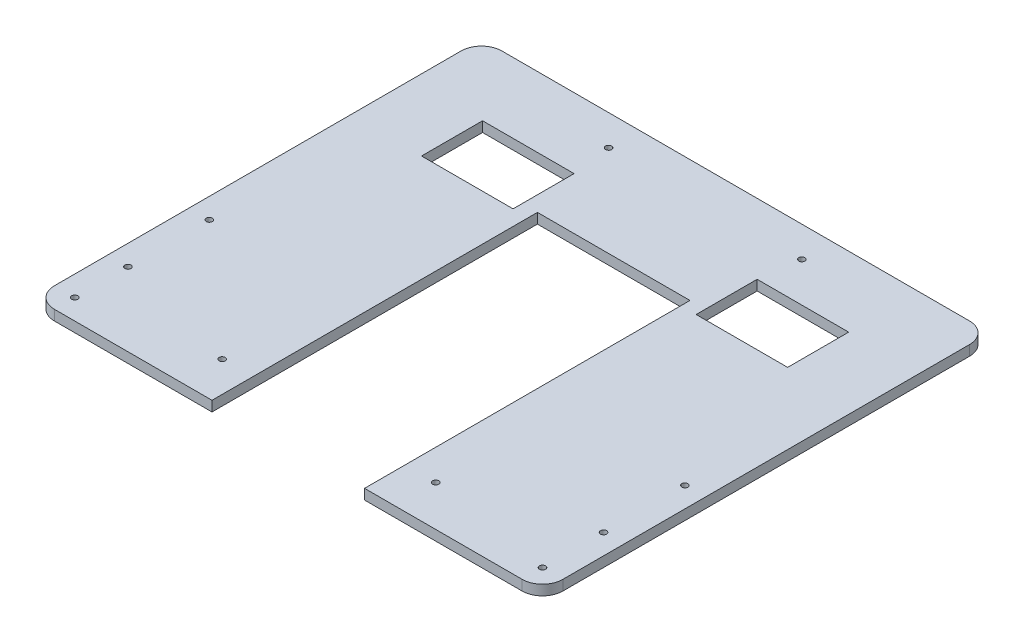
ISO-10303-21;
HEADER;
FILE_DESCRIPTION(('STEP AP214'),'2;1');
FILE_NAME('part.step','',(''),(''),'','','');
FILE_SCHEMA(('AUTOMOTIVE_DESIGN { 1 0 10303 214 1 1 1 1 }'));
ENDSEC;
DATA;
#1=APPLICATION_CONTEXT('core data for automotive mechanical design processes');
#2=APPLICATION_PROTOCOL_DEFINITION('international standard','automotive_design',2000,#1);
#3=PRODUCT_CONTEXT('',#1,'mechanical');
#4=PRODUCT('Part','Part','',(#3));
#5=PRODUCT_RELATED_PRODUCT_CATEGORY('part','',(#4));
#6=PRODUCT_DEFINITION_FORMATION('','',#4);
#7=PRODUCT_DEFINITION_CONTEXT('part definition',#1,'design');
#8=PRODUCT_DEFINITION('design','',#6,#7);
#9=PRODUCT_DEFINITION_SHAPE('','',#8);
#10=(LENGTH_UNIT() NAMED_UNIT(*) SI_UNIT(.MILLI.,.METRE.));
#11=(NAMED_UNIT(*) PLANE_ANGLE_UNIT() SI_UNIT($,.RADIAN.));
#12=(NAMED_UNIT(*) SI_UNIT($,.STERADIAN.) SOLID_ANGLE_UNIT());
#13=UNCERTAINTY_MEASURE_WITH_UNIT(LENGTH_MEASURE(1.E-05),#10,'distance_accuracy_value','');
#14=(GEOMETRIC_REPRESENTATION_CONTEXT(3) GLOBAL_UNCERTAINTY_ASSIGNED_CONTEXT((#13)) GLOBAL_UNIT_ASSIGNED_CONTEXT((#10,
#11,#12)) REPRESENTATION_CONTEXT('',''));
#15=CARTESIAN_POINT('',(0.,0.,0.));
#16=DIRECTION('',(0.,0.,1.));
#17=DIRECTION('',(1.,0.,0.));
#18=AXIS2_PLACEMENT_3D('',#15,#16,#17);
#19=CARTESIAN_POINT('',(10.,5.,210.));
#20=DIRECTION('',(0.,1.,0.));
#21=DIRECTION('',(0.,0.,1.));
#22=AXIS2_PLACEMENT_3D('',#19,#20,#21);
#23=PLANE('',#22);
#24=CARTESIAN_POINT('',(10.0000000000001,5.,183.835525880241));
#25=DIRECTION('',(0.,1.,0.));
#26=DIRECTION('',(0.,0.,1.));
#27=AXIS2_PLACEMENT_3D('',#24,#25,#26);
#28=CIRCLE('',#27,1.5);
#29=CARTESIAN_POINT('',(10.0000000000001,5.,185.335525880241));
#30=VERTEX_POINT('',#29);
#31=EDGE_CURVE('E760',#30,#30,#28,.F.);
#32=ORIENTED_EDGE('',*,*,#31,.T.);
#33=EDGE_LOOP('',(#32));
#34=FACE_BOUND('',#33,.T.);
#35=CARTESIAN_POINT('',(10.0000000000001,5.,143.835525880241));
#36=DIRECTION('',(0.,1.,0.));
#37=DIRECTION('',(0.,0.,1.));
#38=AXIS2_PLACEMENT_3D('',#35,#36,#37);
#39=CIRCLE('',#38,1.5);
#40=CARTESIAN_POINT('',(10.0000000000001,5.,145.335525880241));
#41=VERTEX_POINT('',#40);
#42=EDGE_CURVE('E762',#41,#41,#39,.F.);
#43=ORIENTED_EDGE('',*,*,#42,.T.);
#44=EDGE_LOOP('',(#43));
#45=FACE_BOUND('',#44,.T.);
#46=CARTESIAN_POINT('',(240.,5.,140.));
#47=DIRECTION('',(0.,1.,0.));
#48=DIRECTION('',(0.,0.,1.));
#49=AXIS2_PLACEMENT_3D('',#46,#47,#48);
#50=CIRCLE('',#49,1.5);
#51=CARTESIAN_POINT('',(240.,5.,141.5));
#52=VERTEX_POINT('',#51);
#53=EDGE_CURVE('E833',#52,#52,#50,.F.);
#54=ORIENTED_EDGE('',*,*,#53,.T.);
#55=EDGE_LOOP('',(#54));
#56=FACE_BOUND('',#55,.T.);
#57=CARTESIAN_POINT('',(240.,5.,180.));
#58=DIRECTION('',(0.,1.,0.));
#59=DIRECTION('',(0.,0.,1.));
#60=AXIS2_PLACEMENT_3D('',#57,#58,#59);
#61=CIRCLE('',#60,1.5);
#62=CARTESIAN_POINT('',(240.,5.,181.5));
#63=VERTEX_POINT('',#62);
#64=EDGE_CURVE('E771',#63,#63,#61,.F.);
#65=ORIENTED_EDGE('',*,*,#64,.T.);
#66=EDGE_LOOP('',(#65));
#67=FACE_BOUND('',#66,.T.);
#68=CARTESIAN_POINT('',(172.5,5.,15.));
#69=DIRECTION('',(0.,1.,0.));
#70=DIRECTION('',(0.,0.,1.));
#71=AXIS2_PLACEMENT_3D('',#68,#69,#70);
#72=CIRCLE('',#71,1.49999999999997);
#73=CARTESIAN_POINT('',(172.5,5.,16.5));
#74=VERTEX_POINT('',#73);
#75=EDGE_CURVE('E788',#74,#74,#72,.F.);
#76=ORIENTED_EDGE('',*,*,#75,.T.);
#77=EDGE_LOOP('',(#76));
#78=FACE_BOUND('',#77,.T.);
#79=CARTESIAN_POINT('',(240.,5.,210.));
#80=DIRECTION('',(0.,1.,0.));
#81=DIRECTION('',(0.,0.,1.));
#82=AXIS2_PLACEMENT_3D('',#79,#80,#81);
#83=CIRCLE('',#82,1.50000000000002);
#84=CARTESIAN_POINT('',(240.,5.,211.5));
#85=VERTEX_POINT('',#84);
#86=EDGE_CURVE('E782',#85,#85,#83,.F.);
#87=ORIENTED_EDGE('',*,*,#86,.T.);
#88=EDGE_LOOP('',(#87));
#89=FACE_BOUND('',#88,.T.);
#90=CARTESIAN_POINT('',(10.,5.,210.));
#91=DIRECTION('',(0.,1.,0.));
#92=DIRECTION('',(0.,0.,1.));
#93=AXIS2_PLACEMENT_3D('',#90,#91,#92);
#94=CIRCLE('',#93,1.5);
#95=CARTESIAN_POINT('',(10.,5.,211.5));
#96=VERTEX_POINT('',#95);
#97=EDGE_CURVE('E776',#96,#96,#94,.F.);
#98=ORIENTED_EDGE('',*,*,#97,.T.);
#99=EDGE_LOOP('',(#98));
#100=FACE_BOUND('',#99,.T.);
#101=CARTESIAN_POINT('',(77.5,5.,15.));
#102=DIRECTION('',(0.,1.,0.));
#103=DIRECTION('',(0.,0.,1.));
#104=AXIS2_PLACEMENT_3D('',#101,#102,#103);
#105=CIRCLE('',#104,1.5);
#106=CARTESIAN_POINT('',(77.5,5.,16.5));
#107=VERTEX_POINT('',#106);
#108=EDGE_CURVE('E393',#107,#107,#105,.F.);
#109=ORIENTED_EDGE('',*,*,#108,.T.);
#110=EDGE_LOOP('',(#109));
#111=FACE_BOUND('',#110,.T.);
#112=CARTESIAN_POINT('',(177.5,5.,200.));
#113=DIRECTION('',(0.,1.,0.));
#114=DIRECTION('',(0.,0.,1.));
#115=AXIS2_PLACEMENT_3D('',#112,#113,#114);
#116=CIRCLE('',#115,1.50000000000002);
#117=CARTESIAN_POINT('',(177.5,5.,201.5));
#118=VERTEX_POINT('',#117);
#119=EDGE_CURVE('E396',#118,#118,#116,.T.);
#120=ORIENTED_EDGE('',*,*,#119,.F.);
#121=EDGE_LOOP('',(#120));
#122=FACE_BOUND('',#121,.T.);
#123=DIRECTION('',(0.,0.,1.));
#124=VECTOR('',#123,1.);
#125=CARTESIAN_POINT('',(162.5,5.,220.));
#126=LINE('',#125,#124);
#127=CARTESIAN_POINT('',(162.5,5.,60.));
#128=VERTEX_POINT('',#127);
#129=CARTESIAN_POINT('',(162.5,5.,220.));
#130=VERTEX_POINT('',#129);
#131=EDGE_CURVE('E176',#128,#130,#126,.T.);
#132=ORIENTED_EDGE('',*,*,#131,.T.);
#133=DIRECTION('',(1.,0.,0.));
#134=VECTOR('',#133,1.);
#135=CARTESIAN_POINT('',(10.0000000000001,5.,220.));
#136=LINE('',#135,#134);
#137=CARTESIAN_POINT('',(240.,5.,220.));
#138=VERTEX_POINT('',#137);
#139=EDGE_CURVE('E188',#130,#138,#136,.T.);
#140=ORIENTED_EDGE('',*,*,#139,.T.);
#141=CARTESIAN_POINT('',(240.,5.,210.));
#142=DIRECTION('',(0.,1.,0.));
#143=DIRECTION('',(0.,0.,1.));
#144=AXIS2_PLACEMENT_3D('',#141,#142,#143);
#145=CIRCLE('',#144,10.);
#146=CARTESIAN_POINT('',(250.,5.,210.));
#147=VERTEX_POINT('',#146);
#148=EDGE_CURVE('E200',#138,#147,#145,.T.);
#149=ORIENTED_EDGE('',*,*,#148,.T.);
#150=DIRECTION('',(0.,0.,-1.));
#151=VECTOR('',#150,1.);
#152=CARTESIAN_POINT('',(250.,5.,10.0000000000001));
#153=LINE('',#152,#151);
#154=CARTESIAN_POINT('',(250.,5.,10.0000000000001));
#155=VERTEX_POINT('',#154);
#156=EDGE_CURVE('E207',#147,#155,#153,.T.);
#157=ORIENTED_EDGE('',*,*,#156,.T.);
#158=CARTESIAN_POINT('',(240.,5.,10.));
#159=DIRECTION('',(0.,1.,0.));
#160=DIRECTION('',(0.,0.,-1.));
#161=AXIS2_PLACEMENT_3D('',#158,#159,#160);
#162=CIRCLE('',#161,10.);
#163=CARTESIAN_POINT('',(240.,5.,0.));
#164=VERTEX_POINT('',#163);
#165=EDGE_CURVE('E209',#155,#164,#162,.T.);
#166=ORIENTED_EDGE('',*,*,#165,.T.);
#167=DIRECTION('',(-1.,0.,0.));
#168=VECTOR('',#167,1.);
#169=CARTESIAN_POINT('',(10.0000000000001,5.,0.));
#170=LINE('',#169,#168);
#171=CARTESIAN_POINT('',(10.0000000000001,5.,0.));
#172=VERTEX_POINT('',#171);
#173=EDGE_CURVE('E211',#164,#172,#170,.T.);
#174=ORIENTED_EDGE('',*,*,#173,.T.);
#175=CARTESIAN_POINT('',(10.,5.,10.));
#176=DIRECTION('',(0.,1.,0.));
#177=DIRECTION('',(0.,0.,1.));
#178=AXIS2_PLACEMENT_3D('',#175,#176,#177);
#179=CIRCLE('',#178,10.);
#180=CARTESIAN_POINT('',(0.,5.,10.0000000000001));
#181=VERTEX_POINT('',#180);
#182=EDGE_CURVE('E213',#172,#181,#179,.T.);
#183=ORIENTED_EDGE('',*,*,#182,.T.);
#184=DIRECTION('',(0.,0.,1.));
#185=VECTOR('',#184,1.);
#186=CARTESIAN_POINT('',(0.,5.,10.0000000000001));
#187=LINE('',#186,#185);
#188=CARTESIAN_POINT('',(0.,5.,210.));
#189=VERTEX_POINT('',#188);
#190=EDGE_CURVE('E215',#181,#189,#187,.T.);
#191=ORIENTED_EDGE('',*,*,#190,.T.);
#192=CARTESIAN_POINT('',(10.,5.,210.));
#193=DIRECTION('',(0.,1.,0.));
#194=DIRECTION('',(0.,0.,1.));
#195=AXIS2_PLACEMENT_3D('',#192,#193,#194);
#196=CIRCLE('',#195,10.);
#197=CARTESIAN_POINT('',(10.0000000000001,5.,220.));
#198=VERTEX_POINT('',#197);
#199=EDGE_CURVE('E197',#189,#198,#196,.T.);
#200=ORIENTED_EDGE('',*,*,#199,.T.);
#201=CARTESIAN_POINT('',(87.4999999999999,5.,220.));
#202=VERTEX_POINT('',#201);
#203=EDGE_CURVE('E196',#198,#202,#136,.T.);
#204=ORIENTED_EDGE('',*,*,#203,.T.);
#205=DIRECTION('',(0.,0.,-1.));
#206=VECTOR('',#205,1.);
#207=CARTESIAN_POINT('',(87.5,5.,220.));
#208=LINE('',#207,#206);
#209=CARTESIAN_POINT('',(87.5,5.,60.));
#210=VERTEX_POINT('',#209);
#211=EDGE_CURVE('E51',#202,#210,#208,.T.);
#212=ORIENTED_EDGE('',*,*,#211,.T.);
#213=DIRECTION('',(1.,0.,0.));
#214=VECTOR('',#213,1.);
#215=CARTESIAN_POINT('',(162.5,5.,60.));
#216=LINE('',#215,#214);
#217=EDGE_CURVE('E184',#210,#128,#216,.T.);
#218=ORIENTED_EDGE('',*,*,#217,.T.);
#219=EDGE_LOOP('',(#132,#140,#149,#157,#166,#174,#183,#191,#200,#204,#212,#218));
#220=FACE_BOUND('',#219,.T.);
#221=DIRECTION('',(-1.,0.,0.));
#222=VECTOR('',#221,1.);
#223=CARTESIAN_POINT('',(215.,5.,34.475));
#224=LINE('',#223,#222);
#225=CARTESIAN_POINT('',(215.,5.,34.475));
#226=VERTEX_POINT('',#225);
#227=CARTESIAN_POINT('',(170.,5.,34.475));
#228=VERTEX_POINT('',#227);
#229=EDGE_CURVE('E356',#226,#228,#224,.T.);
#230=ORIENTED_EDGE('',*,*,#229,.F.);
#231=DIRECTION('',(0.,0.,-1.));
#232=VECTOR('',#231,1.);
#233=CARTESIAN_POINT('',(215.,5.,64.475));
#234=LINE('',#233,#232);
#235=CARTESIAN_POINT('',(215.,5.,64.475));
#236=VERTEX_POINT('',#235);
#237=EDGE_CURVE('E343',#236,#226,#234,.T.);
#238=ORIENTED_EDGE('',*,*,#237,.F.);
#239=DIRECTION('',(-1.,0.,0.));
#240=VECTOR('',#239,1.);
#241=CARTESIAN_POINT('',(215.,5.,64.475));
#242=LINE('',#241,#240);
#243=CARTESIAN_POINT('',(170.,5.,64.475));
#244=VERTEX_POINT('',#243);
#245=EDGE_CURVE('E338',#236,#244,#242,.T.);
#246=ORIENTED_EDGE('',*,*,#245,.T.);
#247=DIRECTION('',(0.,0.,-1.));
#248=VECTOR('',#247,1.);
#249=CARTESIAN_POINT('',(170.,5.,64.475));
#250=LINE('',#249,#248);
#251=EDGE_CURVE('E353',#244,#228,#250,.T.);
#252=ORIENTED_EDGE('',*,*,#251,.T.);
#253=EDGE_LOOP('',(#230,#238,#246,#252));
#254=FACE_BOUND('',#253,.T.);
#255=DIRECTION('',(1.,0.,0.));
#256=VECTOR('',#255,1.);
#257=CARTESIAN_POINT('',(0.,5.,34.475));
#258=LINE('',#257,#256);
#259=CARTESIAN_POINT('',(35.,5.,34.475));
#260=VERTEX_POINT('',#259);
#261=CARTESIAN_POINT('',(80.,5.,34.475));
#262=VERTEX_POINT('',#261);
#263=EDGE_CURVE('E305',#260,#262,#258,.T.);
#264=ORIENTED_EDGE('',*,*,#263,.T.);
#265=DIRECTION('',(0.,0.,-1.));
#266=VECTOR('',#265,1.);
#267=CARTESIAN_POINT('',(80.,5.,0.));
#268=LINE('',#267,#266);
#269=CARTESIAN_POINT('',(80.,5.,64.475));
#270=VERTEX_POINT('',#269);
#271=EDGE_CURVE('E299',#270,#262,#268,.T.);
#272=ORIENTED_EDGE('',*,*,#271,.F.);
#273=DIRECTION('',(1.,0.,0.));
#274=VECTOR('',#273,1.);
#275=CARTESIAN_POINT('',(0.,5.,64.475));
#276=LINE('',#275,#274);
#277=CARTESIAN_POINT('',(35.,5.,64.475));
#278=VERTEX_POINT('',#277);
#279=EDGE_CURVE('E301',#278,#270,#276,.T.);
#280=ORIENTED_EDGE('',*,*,#279,.F.);
#281=DIRECTION('',(0.,0.,-1.));
#282=VECTOR('',#281,1.);
#283=CARTESIAN_POINT('',(35.,5.,0.));
#284=LINE('',#283,#282);
#285=EDGE_CURVE('E59',#278,#260,#284,.T.);
#286=ORIENTED_EDGE('',*,*,#285,.T.);
#287=EDGE_LOOP('',(#264,#272,#280,#286));
#288=FACE_BOUND('',#287,.T.);
#289=CARTESIAN_POINT('',(72.5,5.,200.));
#290=DIRECTION('',(0.,1.,0.));
#291=DIRECTION('',(0.,0.,1.));
#292=AXIS2_PLACEMENT_3D('',#289,#290,#291);
#293=CIRCLE('',#292,1.50000000000001);
#294=CARTESIAN_POINT('',(72.5,5.,201.5));
#295=VERTEX_POINT('',#294);
#296=EDGE_CURVE('E386',#295,#295,#293,.F.);
#297=ORIENTED_EDGE('',*,*,#296,.T.);
#298=EDGE_LOOP('',(#297));
#299=FACE_BOUND('',#298,.T.);
#300=ADVANCED_FACE('F36',(#34,#45,#56,#67,#78,#89,#100,#111,#122,#220,#254,#288,#299),#23,.T.);
#301=CARTESIAN_POINT('',(10.,0.,210.));
#302=DIRECTION('',(0.,1.,0.));
#303=DIRECTION('',(0.,0.,1.));
#304=AXIS2_PLACEMENT_3D('',#301,#302,#303);
#305=PLANE('',#304);
#306=CARTESIAN_POINT('',(10.0000000000001,0.,183.835525880241));
#307=DIRECTION('',(0.,-1.,0.));
#308=DIRECTION('',(0.,0.,-1.));
#309=AXIS2_PLACEMENT_3D('',#306,#307,#308);
#310=CIRCLE('',#309,1.5);
#311=CARTESIAN_POINT('',(10.0000000000001,0.,182.335525880241));
#312=VERTEX_POINT('',#311);
#313=EDGE_CURVE('E758',#312,#312,#310,.T.);
#314=ORIENTED_EDGE('',*,*,#313,.F.);
#315=EDGE_LOOP('',(#314));
#316=FACE_BOUND('',#315,.T.);
#317=CARTESIAN_POINT('',(10.0000000000001,0.,143.835525880241));
#318=DIRECTION('',(0.,-1.,0.));
#319=DIRECTION('',(0.,0.,-1.));
#320=AXIS2_PLACEMENT_3D('',#317,#318,#319);
#321=CIRCLE('',#320,1.5);
#322=CARTESIAN_POINT('',(10.0000000000001,0.,142.335525880241));
#323=VERTEX_POINT('',#322);
#324=EDGE_CURVE('E765',#323,#323,#321,.T.);
#325=ORIENTED_EDGE('',*,*,#324,.F.);
#326=EDGE_LOOP('',(#325));
#327=FACE_BOUND('',#326,.T.);
#328=CARTESIAN_POINT('',(240.,0.,140.));
#329=DIRECTION('',(0.,-1.,0.));
#330=DIRECTION('',(0.,0.,-1.));
#331=AXIS2_PLACEMENT_3D('',#328,#329,#330);
#332=CIRCLE('',#331,1.5);
#333=CARTESIAN_POINT('',(240.,0.,138.5));
#334=VERTEX_POINT('',#333);
#335=EDGE_CURVE('E772',#334,#334,#332,.T.);
#336=ORIENTED_EDGE('',*,*,#335,.F.);
#337=EDGE_LOOP('',(#336));
#338=FACE_BOUND('',#337,.T.);
#339=CARTESIAN_POINT('',(240.,0.,180.));
#340=DIRECTION('',(0.,-1.,0.));
#341=DIRECTION('',(0.,0.,-1.));
#342=AXIS2_PLACEMENT_3D('',#339,#340,#341);
#343=CIRCLE('',#342,1.5);
#344=CARTESIAN_POINT('',(240.,0.,178.5));
#345=VERTEX_POINT('',#344);
#346=EDGE_CURVE('E768',#345,#345,#343,.T.);
#347=ORIENTED_EDGE('',*,*,#346,.F.);
#348=EDGE_LOOP('',(#347));
#349=FACE_BOUND('',#348,.T.);
#350=CARTESIAN_POINT('',(172.5,0.,15.));
#351=DIRECTION('',(0.,-1.,0.));
#352=DIRECTION('',(0.,0.,1.));
#353=AXIS2_PLACEMENT_3D('',#350,#351,#352);
#354=CIRCLE('',#353,1.49999999999997);
#355=CARTESIAN_POINT('',(172.5,0.,16.5));
#356=VERTEX_POINT('',#355);
#357=EDGE_CURVE('E775',#356,#356,#354,.T.);
#358=ORIENTED_EDGE('',*,*,#357,.F.);
#359=EDGE_LOOP('',(#358));
#360=FACE_BOUND('',#359,.T.);
#361=CARTESIAN_POINT('',(240.,0.,210.));
#362=DIRECTION('',(0.,-1.,0.));
#363=DIRECTION('',(0.,0.,1.));
#364=AXIS2_PLACEMENT_3D('',#361,#362,#363);
#365=CIRCLE('',#364,1.50000000000002);
#366=CARTESIAN_POINT('',(240.,0.,211.5));
#367=VERTEX_POINT('',#366);
#368=EDGE_CURVE('E785',#367,#367,#365,.T.);
#369=ORIENTED_EDGE('',*,*,#368,.F.);
#370=EDGE_LOOP('',(#369));
#371=FACE_BOUND('',#370,.T.);
#372=CARTESIAN_POINT('',(10.,0.,210.));
#373=DIRECTION('',(0.,-1.,0.));
#374=DIRECTION('',(0.,0.,-1.));
#375=AXIS2_PLACEMENT_3D('',#372,#373,#374);
#376=CIRCLE('',#375,1.5);
#377=CARTESIAN_POINT('',(10.,0.,208.5));
#378=VERTEX_POINT('',#377);
#379=EDGE_CURVE('E779',#378,#378,#376,.T.);
#380=ORIENTED_EDGE('',*,*,#379,.F.);
#381=EDGE_LOOP('',(#380));
#382=FACE_BOUND('',#381,.T.);
#383=CARTESIAN_POINT('',(77.5,0.,15.));
#384=DIRECTION('',(0.,-1.,0.));
#385=DIRECTION('',(0.,0.,-1.));
#386=AXIS2_PLACEMENT_3D('',#383,#384,#385);
#387=CIRCLE('',#386,1.5);
#388=CARTESIAN_POINT('',(77.5,0.,13.5));
#389=VERTEX_POINT('',#388);
#390=EDGE_CURVE('E399',#389,#389,#387,.T.);
#391=ORIENTED_EDGE('',*,*,#390,.F.);
#392=EDGE_LOOP('',(#391));
#393=FACE_BOUND('',#392,.T.);
#394=DIRECTION('',(0.,0.,-1.));
#395=VECTOR('',#394,1.);
#396=CARTESIAN_POINT('',(80.,0.,0.));
#397=LINE('',#396,#395);
#398=CARTESIAN_POINT('',(80.,0.,64.475));
#399=VERTEX_POINT('',#398);
#400=CARTESIAN_POINT('',(80.,0.,34.475));
#401=VERTEX_POINT('',#400);
#402=EDGE_CURVE('E309',#399,#401,#397,.T.);
#403=ORIENTED_EDGE('',*,*,#402,.T.);
#404=DIRECTION('',(1.,0.,0.));
#405=VECTOR('',#404,1.);
#406=CARTESIAN_POINT('',(0.,0.,34.475));
#407=LINE('',#406,#405);
#408=CARTESIAN_POINT('',(35.,0.,34.475));
#409=VERTEX_POINT('',#408);
#410=EDGE_CURVE('E302',#409,#401,#407,.T.);
#411=ORIENTED_EDGE('',*,*,#410,.F.);
#412=DIRECTION('',(0.,0.,-1.));
#413=VECTOR('',#412,1.);
#414=CARTESIAN_POINT('',(35.,0.,0.));
#415=LINE('',#414,#413);
#416=CARTESIAN_POINT('',(35.,0.,64.475));
#417=VERTEX_POINT('',#416);
#418=EDGE_CURVE('E316',#417,#409,#415,.T.);
#419=ORIENTED_EDGE('',*,*,#418,.F.);
#420=DIRECTION('',(1.,0.,0.));
#421=VECTOR('',#420,1.);
#422=CARTESIAN_POINT('',(0.,0.,64.475));
#423=LINE('',#422,#421);
#424=EDGE_CURVE('E312',#417,#399,#423,.T.);
#425=ORIENTED_EDGE('',*,*,#424,.T.);
#426=EDGE_LOOP('',(#403,#411,#419,#425));
#427=FACE_BOUND('',#426,.T.);
#428=DIRECTION('',(1.,0.,0.));
#429=VECTOR('',#428,1.);
#430=CARTESIAN_POINT('',(10.0000000000001,0.,220.));
#431=LINE('',#430,#429);
#432=CARTESIAN_POINT('',(162.5,0.,220.));
#433=VERTEX_POINT('',#432);
#434=CARTESIAN_POINT('',(240.,0.,220.));
#435=VERTEX_POINT('',#434);
#436=EDGE_CURVE('E221',#433,#435,#431,.T.);
#437=ORIENTED_EDGE('',*,*,#436,.F.);
#438=DIRECTION('',(0.,0.,1.));
#439=VECTOR('',#438,1.);
#440=CARTESIAN_POINT('',(162.5,0.,220.));
#441=LINE('',#440,#439);
#442=CARTESIAN_POINT('',(162.5,0.,60.));
#443=VERTEX_POINT('',#442);
#444=EDGE_CURVE('E179',#443,#433,#441,.T.);
#445=ORIENTED_EDGE('',*,*,#444,.F.);
#446=DIRECTION('',(1.,0.,0.));
#447=VECTOR('',#446,1.);
#448=CARTESIAN_POINT('',(162.5,0.,60.));
#449=LINE('',#448,#447);
#450=CARTESIAN_POINT('',(87.5,0.,60.));
#451=VERTEX_POINT('',#450);
#452=EDGE_CURVE('E191',#451,#443,#449,.T.);
#453=ORIENTED_EDGE('',*,*,#452,.F.);
#454=DIRECTION('',(0.,0.,-1.));
#455=VECTOR('',#454,1.);
#456=CARTESIAN_POINT('',(87.5,0.,220.));
#457=LINE('',#456,#455);
#458=CARTESIAN_POINT('',(87.5,0.,220.));
#459=VERTEX_POINT('',#458);
#460=EDGE_CURVE('E388',#459,#451,#457,.T.);
#461=ORIENTED_EDGE('',*,*,#460,.F.);
#462=CARTESIAN_POINT('',(10.0000000000001,0.,220.));
#463=VERTEX_POINT('',#462);
#464=EDGE_CURVE('E223',#463,#459,#431,.T.);
#465=ORIENTED_EDGE('',*,*,#464,.F.);
#466=CARTESIAN_POINT('',(10.,0.,210.));
#467=DIRECTION('',(0.,1.,0.));
#468=DIRECTION('',(0.,0.,1.));
#469=AXIS2_PLACEMENT_3D('',#466,#467,#468);
#470=CIRCLE('',#469,10.);
#471=CARTESIAN_POINT('',(0.,0.,210.));
#472=VERTEX_POINT('',#471);
#473=EDGE_CURVE('E218',#472,#463,#470,.T.);
#474=ORIENTED_EDGE('',*,*,#473,.F.);
#475=DIRECTION('',(0.,0.,1.));
#476=VECTOR('',#475,1.);
#477=CARTESIAN_POINT('',(0.,0.,10.0000000000001));
#478=LINE('',#477,#476);
#479=CARTESIAN_POINT('',(0.,0.,10.0000000000001));
#480=VERTEX_POINT('',#479);
#481=EDGE_CURVE('E202',#480,#472,#478,.T.);
#482=ORIENTED_EDGE('',*,*,#481,.F.);
#483=CARTESIAN_POINT('',(10.,0.,10.));
#484=DIRECTION('',(0.,1.,0.));
#485=DIRECTION('',(0.,0.,1.));
#486=AXIS2_PLACEMENT_3D('',#483,#484,#485);
#487=CIRCLE('',#486,10.);
#488=CARTESIAN_POINT('',(10.0000000000001,0.,0.));
#489=VERTEX_POINT('',#488);
#490=EDGE_CURVE('E234',#489,#480,#487,.T.);
#491=ORIENTED_EDGE('',*,*,#490,.F.);
#492=DIRECTION('',(-1.,0.,0.));
#493=VECTOR('',#492,1.);
#494=CARTESIAN_POINT('',(10.0000000000001,0.,0.));
#495=LINE('',#494,#493);
#496=CARTESIAN_POINT('',(240.,0.,0.));
#497=VERTEX_POINT('',#496);
#498=EDGE_CURVE('E232',#497,#489,#495,.T.);
#499=ORIENTED_EDGE('',*,*,#498,.F.);
#500=CARTESIAN_POINT('',(240.,0.,10.));
#501=DIRECTION('',(0.,1.,0.));
#502=DIRECTION('',(0.,0.,-1.));
#503=AXIS2_PLACEMENT_3D('',#500,#501,#502);
#504=CIRCLE('',#503,10.);
#505=CARTESIAN_POINT('',(250.,0.,10.0000000000001));
#506=VERTEX_POINT('',#505);
#507=EDGE_CURVE('E230',#506,#497,#504,.T.);
#508=ORIENTED_EDGE('',*,*,#507,.F.);
#509=DIRECTION('',(0.,0.,-1.));
#510=VECTOR('',#509,1.);
#511=CARTESIAN_POINT('',(250.,0.,10.0000000000001));
#512=LINE('',#511,#510);
#513=CARTESIAN_POINT('',(250.,0.,210.));
#514=VERTEX_POINT('',#513);
#515=EDGE_CURVE('E228',#514,#506,#512,.T.);
#516=ORIENTED_EDGE('',*,*,#515,.F.);
#517=CARTESIAN_POINT('',(240.,0.,210.));
#518=DIRECTION('',(0.,1.,0.));
#519=DIRECTION('',(0.,0.,1.));
#520=AXIS2_PLACEMENT_3D('',#517,#518,#519);
#521=CIRCLE('',#520,10.);
#522=EDGE_CURVE('E226',#435,#514,#521,.T.);
#523=ORIENTED_EDGE('',*,*,#522,.F.);
#524=EDGE_LOOP('',(#437,#445,#453,#461,#465,#474,#482,#491,#499,#508,#516,#523));
#525=FACE_BOUND('',#524,.T.);
#526=DIRECTION('',(0.,0.,-1.));
#527=VECTOR('',#526,1.);
#528=CARTESIAN_POINT('',(215.,0.,64.475));
#529=LINE('',#528,#527);
#530=CARTESIAN_POINT('',(215.,0.,64.475));
#531=VERTEX_POINT('',#530);
#532=CARTESIAN_POINT('',(215.,0.,34.475));
#533=VERTEX_POINT('',#532);
#534=EDGE_CURVE('E313',#531,#533,#529,.T.);
#535=ORIENTED_EDGE('',*,*,#534,.T.);
#536=DIRECTION('',(-1.,0.,0.));
#537=VECTOR('',#536,1.);
#538=CARTESIAN_POINT('',(215.,0.,34.475));
#539=LINE('',#538,#537);
#540=CARTESIAN_POINT('',(170.,0.,34.475));
#541=VERTEX_POINT('',#540);
#542=EDGE_CURVE('E346',#533,#541,#539,.T.);
#543=ORIENTED_EDGE('',*,*,#542,.T.);
#544=DIRECTION('',(0.,0.,-1.));
#545=VECTOR('',#544,1.);
#546=CARTESIAN_POINT('',(170.,0.,64.475));
#547=LINE('',#546,#545);
#548=CARTESIAN_POINT('',(170.,0.,64.475));
#549=VERTEX_POINT('',#548);
#550=EDGE_CURVE('E342',#549,#541,#547,.T.);
#551=ORIENTED_EDGE('',*,*,#550,.F.);
#552=DIRECTION('',(-1.,0.,0.));
#553=VECTOR('',#552,1.);
#554=CARTESIAN_POINT('',(215.,0.,64.475));
#555=LINE('',#554,#553);
#556=EDGE_CURVE('E339',#531,#549,#555,.T.);
#557=ORIENTED_EDGE('',*,*,#556,.F.);
#558=EDGE_LOOP('',(#535,#543,#551,#557));
#559=FACE_BOUND('',#558,.T.);
#560=CARTESIAN_POINT('',(177.5,0.,200.));
#561=DIRECTION('',(0.,1.,0.));
#562=DIRECTION('',(0.,0.,1.));
#563=AXIS2_PLACEMENT_3D('',#560,#561,#562);
#564=CIRCLE('',#563,1.50000000000002);
#565=CARTESIAN_POINT('',(177.5,0.,201.5));
#566=VERTEX_POINT('',#565);
#567=EDGE_CURVE('E381',#566,#566,#564,.T.);
#568=ORIENTED_EDGE('',*,*,#567,.T.);
#569=EDGE_LOOP('',(#568));
#570=FACE_BOUND('',#569,.T.);
#571=CARTESIAN_POINT('',(72.5,0.,200.));
#572=DIRECTION('',(0.,-1.,0.));
#573=DIRECTION('',(0.,0.,-1.));
#574=AXIS2_PLACEMENT_3D('',#571,#572,#573);
#575=CIRCLE('',#574,1.50000000000001);
#576=CARTESIAN_POINT('',(72.5,0.,198.5));
#577=VERTEX_POINT('',#576);
#578=EDGE_CURVE('E384',#577,#577,#575,.T.);
#579=ORIENTED_EDGE('',*,*,#578,.F.);
#580=EDGE_LOOP('',(#579));
#581=FACE_BOUND('',#580,.T.);
#582=ADVANCED_FACE('F259',(#316,#327,#338,#349,#360,#371,#382,#393,#427,#525,#559,#570,#581),
#305,.F.);
#583=CARTESIAN_POINT('',(10.0000000000001,5.,220.));
#584=DIRECTION('',(0.,0.,-1.));
#585=DIRECTION('',(-1.,0.,0.));
#586=AXIS2_PLACEMENT_3D('',#583,#584,#585);
#587=PLANE('',#586);
#588=ORIENTED_EDGE('',*,*,#139,.F.);
#589=DIRECTION('',(0.,-1.,0.));
#590=VECTOR('',#589,1.);
#591=CARTESIAN_POINT('',(162.5,5.,220.));
#592=LINE('',#591,#590);
#593=EDGE_CURVE('E173',#130,#433,#592,.T.);
#594=ORIENTED_EDGE('',*,*,#593,.T.);
#595=ORIENTED_EDGE('',*,*,#436,.T.);
#596=DIRECTION('',(0.,-1.,0.));
#597=VECTOR('',#596,1.);
#598=CARTESIAN_POINT('',(240.,5.,220.));
#599=LINE('',#598,#597);
#600=EDGE_CURVE('E44',#138,#435,#599,.T.);
#601=ORIENTED_EDGE('',*,*,#600,.F.);
#602=EDGE_LOOP('',(#588,#594,#595,#601));
#603=FACE_BOUND('',#602,.T.);
#604=ADVANCED_FACE('F193',(#603),#587,.F.);
#605=CARTESIAN_POINT('',(10.,5.,210.));
#606=DIRECTION('',(0.,-1.,0.));
#607=DIRECTION('',(0.,0.,-1.));
#608=AXIS2_PLACEMENT_3D('',#605,#606,#607);
#609=CYLINDRICAL_SURFACE('',#608,10.);
#610=ORIENTED_EDGE('',*,*,#473,.T.);
#611=DIRECTION('',(0.,-1.,0.));
#612=VECTOR('',#611,1.);
#613=CARTESIAN_POINT('',(10.0000000000001,5.,220.));
#614=LINE('',#613,#612);
#615=EDGE_CURVE('E11',#198,#463,#614,.T.);
#616=ORIENTED_EDGE('',*,*,#615,.F.);
#617=ORIENTED_EDGE('',*,*,#199,.F.);
#618=DIRECTION('',(0.,-1.,0.));
#619=VECTOR('',#618,1.);
#620=CARTESIAN_POINT('',(0.,5.,210.));
#621=LINE('',#620,#619);
#622=EDGE_CURVE('E217',#189,#472,#621,.T.);
#623=ORIENTED_EDGE('',*,*,#622,.T.);
#624=EDGE_LOOP('',(#610,#616,#617,#623));
#625=FACE_BOUND('',#624,.T.);
#626=ADVANCED_FACE('F38',(#625),#609,.T.);
#627=ORIENTED_EDGE('',*,*,#464,.T.);
#628=DIRECTION('',(0.,-1.,0.));
#629=VECTOR('',#628,1.);
#630=CARTESIAN_POINT('',(87.5,5.,220.));
#631=LINE('',#630,#629);
#632=EDGE_CURVE('E183',#202,#459,#631,.T.);
#633=ORIENTED_EDGE('',*,*,#632,.F.);
#634=ORIENTED_EDGE('',*,*,#203,.F.);
#635=ORIENTED_EDGE('',*,*,#615,.T.);
#636=EDGE_LOOP('',(#627,#633,#634,#635));
#637=FACE_BOUND('',#636,.T.);
#638=ADVANCED_FACE('F290',(#637),#587,.F.);
#639=CARTESIAN_POINT('',(240.,5.,210.));
#640=DIRECTION('',(0.,-1.,0.));
#641=DIRECTION('',(0.,0.,-1.));
#642=AXIS2_PLACEMENT_3D('',#639,#640,#641);
#643=CYLINDRICAL_SURFACE('',#642,10.);
#644=ORIENTED_EDGE('',*,*,#522,.T.);
#645=DIRECTION('',(0.,-1.,0.));
#646=VECTOR('',#645,1.);
#647=CARTESIAN_POINT('',(250.,5.,210.));
#648=LINE('',#647,#646);
#649=EDGE_CURVE('E251',#147,#514,#648,.T.);
#650=ORIENTED_EDGE('',*,*,#649,.F.);
#651=ORIENTED_EDGE('',*,*,#148,.F.);
#652=ORIENTED_EDGE('',*,*,#600,.T.);
#653=EDGE_LOOP('',(#644,#650,#651,#652));
#654=FACE_BOUND('',#653,.T.);
#655=ADVANCED_FACE('F255',(#654),#643,.T.);
#656=CARTESIAN_POINT('',(250.,5.,10.0000000000001));
#657=DIRECTION('',(-1.,0.,0.));
#658=DIRECTION('',(0.,0.,1.));
#659=AXIS2_PLACEMENT_3D('',#656,#657,#658);
#660=PLANE('',#659);
#661=ORIENTED_EDGE('',*,*,#515,.T.);
#662=DIRECTION('',(0.,-1.,0.));
#663=VECTOR('',#662,1.);
#664=CARTESIAN_POINT('',(250.,5.,10.0000000000001));
#665=LINE('',#664,#663);
#666=EDGE_CURVE('E248',#155,#506,#665,.T.);
#667=ORIENTED_EDGE('',*,*,#666,.F.);
#668=ORIENTED_EDGE('',*,*,#156,.F.);
#669=ORIENTED_EDGE('',*,*,#649,.T.);
#670=EDGE_LOOP('',(#661,#667,#668,#669));
#671=FACE_BOUND('',#670,.T.);
#672=ADVANCED_FACE('F265',(#671),#660,.F.);
#673=CARTESIAN_POINT('',(240.,5.,10.));
#674=DIRECTION('',(0.,-1.,0.));
#675=DIRECTION('',(0.,0.,-1.));
#676=AXIS2_PLACEMENT_3D('',#673,#674,#675);
#677=CYLINDRICAL_SURFACE('',#676,10.);
#678=ORIENTED_EDGE('',*,*,#507,.T.);
#679=DIRECTION('',(0.,-1.,0.));
#680=VECTOR('',#679,1.);
#681=CARTESIAN_POINT('',(240.,5.,0.));
#682=LINE('',#681,#680);
#683=EDGE_CURVE('E245',#164,#497,#682,.T.);
#684=ORIENTED_EDGE('',*,*,#683,.F.);
#685=ORIENTED_EDGE('',*,*,#165,.F.);
#686=ORIENTED_EDGE('',*,*,#666,.T.);
#687=EDGE_LOOP('',(#678,#684,#685,#686));
#688=FACE_BOUND('',#687,.T.);
#689=ADVANCED_FACE('F269',(#688),#677,.T.);
#690=CARTESIAN_POINT('',(10.0000000000001,5.,0.));
#691=DIRECTION('',(0.,0.,1.));
#692=DIRECTION('',(1.,0.,0.));
#693=AXIS2_PLACEMENT_3D('',#690,#691,#692);
#694=PLANE('',#693);
#695=ORIENTED_EDGE('',*,*,#498,.T.);
#696=DIRECTION('',(0.,-1.,0.));
#697=VECTOR('',#696,1.);
#698=CARTESIAN_POINT('',(10.0000000000001,5.,0.));
#699=LINE('',#698,#697);
#700=EDGE_CURVE('E242',#172,#489,#699,.T.);
#701=ORIENTED_EDGE('',*,*,#700,.F.);
#702=ORIENTED_EDGE('',*,*,#173,.F.);
#703=ORIENTED_EDGE('',*,*,#683,.T.);
#704=EDGE_LOOP('',(#695,#701,#702,#703));
#705=FACE_BOUND('',#704,.T.);
#706=ADVANCED_FACE('F276',(#705),#694,.F.);
#707=CARTESIAN_POINT('',(10.,5.,10.));
#708=DIRECTION('',(0.,-1.,0.));
#709=DIRECTION('',(0.,0.,-1.));
#710=AXIS2_PLACEMENT_3D('',#707,#708,#709);
#711=CYLINDRICAL_SURFACE('',#710,10.);
#712=ORIENTED_EDGE('',*,*,#490,.T.);
#713=DIRECTION('',(0.,-1.,0.));
#714=VECTOR('',#713,1.);
#715=CARTESIAN_POINT('',(0.,5.,10.0000000000001));
#716=LINE('',#715,#714);
#717=EDGE_CURVE('E239',#181,#480,#716,.T.);
#718=ORIENTED_EDGE('',*,*,#717,.F.);
#719=ORIENTED_EDGE('',*,*,#182,.F.);
#720=ORIENTED_EDGE('',*,*,#700,.T.);
#721=EDGE_LOOP('',(#712,#718,#719,#720));
#722=FACE_BOUND('',#721,.T.);
#723=ADVANCED_FACE('F279',(#722),#711,.T.);
#724=CARTESIAN_POINT('',(0.,5.,10.0000000000001));
#725=DIRECTION('',(1.,0.,0.));
#726=DIRECTION('',(0.,0.,-1.));
#727=AXIS2_PLACEMENT_3D('',#724,#725,#726);
#728=PLANE('',#727);
#729=ORIENTED_EDGE('',*,*,#481,.T.);
#730=ORIENTED_EDGE('',*,*,#622,.F.);
#731=ORIENTED_EDGE('',*,*,#190,.F.);
#732=ORIENTED_EDGE('',*,*,#717,.T.);
#733=EDGE_LOOP('',(#729,#730,#731,#732));
#734=FACE_BOUND('',#733,.T.);
#735=ADVANCED_FACE('F284',(#734),#728,.F.);
#736=CARTESIAN_POINT('',(215.,5.,64.475));
#737=DIRECTION('',(-1.,0.,0.));
#738=DIRECTION('',(0.,0.,1.));
#739=AXIS2_PLACEMENT_3D('',#736,#737,#738);
#740=PLANE('',#739);
#741=ORIENTED_EDGE('',*,*,#534,.F.);
#742=DIRECTION('',(0.,-1.,0.));
#743=VECTOR('',#742,1.);
#744=CARTESIAN_POINT('',(215.,5.,64.475));
#745=LINE('',#744,#743);
#746=EDGE_CURVE('E335',#236,#531,#745,.T.);
#747=ORIENTED_EDGE('',*,*,#746,.F.);
#748=ORIENTED_EDGE('',*,*,#237,.T.);
#749=DIRECTION('',(0.,-1.,0.));
#750=VECTOR('',#749,1.);
#751=CARTESIAN_POINT('',(215.,5.,34.475));
#752=LINE('',#751,#750);
#753=EDGE_CURVE('E328',#226,#533,#752,.T.);
#754=ORIENTED_EDGE('',*,*,#753,.T.);
#755=EDGE_LOOP('',(#741,#747,#748,#754));
#756=FACE_BOUND('',#755,.T.);
#757=ADVANCED_FACE('F360',(#756),#740,.T.);
#758=CARTESIAN_POINT('',(215.,5.,34.475));
#759=DIRECTION('',(0.,0.,1.));
#760=DIRECTION('',(1.,0.,0.));
#761=AXIS2_PLACEMENT_3D('',#758,#759,#760);
#762=PLANE('',#761);
#763=ORIENTED_EDGE('',*,*,#542,.F.);
#764=ORIENTED_EDGE('',*,*,#753,.F.);
#765=ORIENTED_EDGE('',*,*,#229,.T.);
#766=DIRECTION('',(0.,-1.,0.));
#767=VECTOR('',#766,1.);
#768=CARTESIAN_POINT('',(170.,5.,34.475));
#769=LINE('',#768,#767);
#770=EDGE_CURVE('E331',#228,#541,#769,.T.);
#771=ORIENTED_EDGE('',*,*,#770,.T.);
#772=EDGE_LOOP('',(#763,#764,#765,#771));
#773=FACE_BOUND('',#772,.T.);
#774=ADVANCED_FACE('F364',(#773),#762,.T.);
#775=CARTESIAN_POINT('',(170.,5.,64.475));
#776=DIRECTION('',(-1.,0.,0.));
#777=DIRECTION('',(0.,0.,1.));
#778=AXIS2_PLACEMENT_3D('',#775,#776,#777);
#779=PLANE('',#778);
#780=ORIENTED_EDGE('',*,*,#550,.T.);
#781=ORIENTED_EDGE('',*,*,#770,.F.);
#782=ORIENTED_EDGE('',*,*,#251,.F.);
#783=DIRECTION('',(0.,-1.,0.));
#784=VECTOR('',#783,1.);
#785=CARTESIAN_POINT('',(170.,5.,64.475));
#786=LINE('',#785,#784);
#787=EDGE_CURVE('E333',#244,#549,#786,.T.);
#788=ORIENTED_EDGE('',*,*,#787,.T.);
#789=EDGE_LOOP('',(#780,#781,#782,#788));
#790=FACE_BOUND('',#789,.T.);
#791=ADVANCED_FACE('F369',(#790),#779,.F.);
#792=CARTESIAN_POINT('',(215.,5.,64.475));
#793=DIRECTION('',(0.,0.,1.));
#794=DIRECTION('',(1.,0.,0.));
#795=AXIS2_PLACEMENT_3D('',#792,#793,#794);
#796=PLANE('',#795);
#797=ORIENTED_EDGE('',*,*,#556,.T.);
#798=ORIENTED_EDGE('',*,*,#787,.F.);
#799=ORIENTED_EDGE('',*,*,#245,.F.);
#800=ORIENTED_EDGE('',*,*,#746,.T.);
#801=EDGE_LOOP('',(#797,#798,#799,#800));
#802=FACE_BOUND('',#801,.T.);
#803=ADVANCED_FACE('F371',(#802),#796,.F.);
#804=CARTESIAN_POINT('',(80.,5.,0.));
#805=DIRECTION('',(-1.,0.,0.));
#806=DIRECTION('',(0.,0.,1.));
#807=AXIS2_PLACEMENT_3D('',#804,#805,#806);
#808=PLANE('',#807);
#809=ORIENTED_EDGE('',*,*,#402,.F.);
#810=DIRECTION('',(0.,-1.,0.));
#811=VECTOR('',#810,1.);
#812=CARTESIAN_POINT('',(80.,5.,64.475));
#813=LINE('',#812,#811);
#814=EDGE_CURVE('E308',#270,#399,#813,.T.);
#815=ORIENTED_EDGE('',*,*,#814,.F.);
#816=ORIENTED_EDGE('',*,*,#271,.T.);
#817=DIRECTION('',(0.,-1.,0.));
#818=VECTOR('',#817,1.);
#819=CARTESIAN_POINT('',(80.,5.,34.475));
#820=LINE('',#819,#818);
#821=EDGE_CURVE('E222',#262,#401,#820,.T.);
#822=ORIENTED_EDGE('',*,*,#821,.T.);
#823=EDGE_LOOP('',(#809,#815,#816,#822));
#824=FACE_BOUND('',#823,.T.);
#825=ADVANCED_FACE('F484',(#824),#808,.T.);
#826=CARTESIAN_POINT('',(0.,5.,34.475));
#827=DIRECTION('',(0.,0.,-1.));
#828=DIRECTION('',(-1.,0.,0.));
#829=AXIS2_PLACEMENT_3D('',#826,#827,#828);
#830=PLANE('',#829);
#831=ORIENTED_EDGE('',*,*,#410,.T.);
#832=ORIENTED_EDGE('',*,*,#821,.F.);
#833=ORIENTED_EDGE('',*,*,#263,.F.);
#834=DIRECTION('',(0.,-1.,0.));
#835=VECTOR('',#834,1.);
#836=CARTESIAN_POINT('',(35.,5.,34.475));
#837=LINE('',#836,#835);
#838=EDGE_CURVE('E322',#260,#409,#837,.T.);
#839=ORIENTED_EDGE('',*,*,#838,.T.);
#840=EDGE_LOOP('',(#831,#832,#833,#839));
#841=FACE_BOUND('',#840,.T.);
#842=ADVANCED_FACE('F473',(#841),#830,.F.);
#843=CARTESIAN_POINT('',(35.,5.,0.));
#844=DIRECTION('',(-1.,0.,0.));
#845=DIRECTION('',(0.,0.,1.));
#846=AXIS2_PLACEMENT_3D('',#843,#844,#845);
#847=PLANE('',#846);
#848=ORIENTED_EDGE('',*,*,#418,.T.);
#849=ORIENTED_EDGE('',*,*,#838,.F.);
#850=ORIENTED_EDGE('',*,*,#285,.F.);
#851=DIRECTION('',(0.,-1.,0.));
#852=VECTOR('',#851,1.);
#853=CARTESIAN_POINT('',(35.,5.,64.475));
#854=LINE('',#853,#852);
#855=EDGE_CURVE('E324',#278,#417,#854,.T.);
#856=ORIENTED_EDGE('',*,*,#855,.T.);
#857=EDGE_LOOP('',(#848,#849,#850,#856));
#858=FACE_BOUND('',#857,.T.);
#859=ADVANCED_FACE('F461',(#858),#847,.F.);
#860=CARTESIAN_POINT('',(0.,5.,64.475));
#861=DIRECTION('',(0.,0.,-1.));
#862=DIRECTION('',(-1.,0.,0.));
#863=AXIS2_PLACEMENT_3D('',#860,#861,#862);
#864=PLANE('',#863);
#865=ORIENTED_EDGE('',*,*,#424,.F.);
#866=ORIENTED_EDGE('',*,*,#855,.F.);
#867=ORIENTED_EDGE('',*,*,#279,.T.);
#868=ORIENTED_EDGE('',*,*,#814,.T.);
#869=EDGE_LOOP('',(#865,#866,#867,#868));
#870=FACE_BOUND('',#869,.T.);
#871=ADVANCED_FACE('F456',(#870),#864,.T.);
#872=CARTESIAN_POINT('',(162.5,5.,220.));
#873=DIRECTION('',(1.,0.,0.));
#874=DIRECTION('',(0.,0.,-1.));
#875=AXIS2_PLACEMENT_3D('',#872,#873,#874);
#876=PLANE('',#875);
#877=ORIENTED_EDGE('',*,*,#444,.T.);
#878=ORIENTED_EDGE('',*,*,#593,.F.);
#879=ORIENTED_EDGE('',*,*,#131,.F.);
#880=DIRECTION('',(0.,-1.,0.));
#881=VECTOR('',#880,1.);
#882=CARTESIAN_POINT('',(162.5,5.,60.));
#883=LINE('',#882,#881);
#884=EDGE_CURVE('E295',#128,#443,#883,.T.);
#885=ORIENTED_EDGE('',*,*,#884,.T.);
#886=EDGE_LOOP('',(#877,#878,#879,#885));
#887=FACE_BOUND('',#886,.T.);
#888=ADVANCED_FACE('F175',(#887),#876,.F.);
#889=CARTESIAN_POINT('',(162.5,5.,60.));
#890=DIRECTION('',(0.,0.,-1.));
#891=DIRECTION('',(-1.,0.,0.));
#892=AXIS2_PLACEMENT_3D('',#889,#890,#891);
#893=PLANE('',#892);
#894=ORIENTED_EDGE('',*,*,#452,.T.);
#895=ORIENTED_EDGE('',*,*,#884,.F.);
#896=ORIENTED_EDGE('',*,*,#217,.F.);
#897=DIRECTION('',(0.,-1.,0.));
#898=VECTOR('',#897,1.);
#899=CARTESIAN_POINT('',(87.5,5.,60.));
#900=LINE('',#899,#898);
#901=EDGE_CURVE('E293',#210,#451,#900,.T.);
#902=ORIENTED_EDGE('',*,*,#901,.T.);
#903=EDGE_LOOP('',(#894,#895,#896,#902));
#904=FACE_BOUND('',#903,.T.);
#905=ADVANCED_FACE('F407',(#904),#893,.F.);
#906=CARTESIAN_POINT('',(87.5,5.,220.));
#907=DIRECTION('',(-1.,0.,0.));
#908=DIRECTION('',(0.,0.,1.));
#909=AXIS2_PLACEMENT_3D('',#906,#907,#908);
#910=PLANE('',#909);
#911=ORIENTED_EDGE('',*,*,#460,.T.);
#912=ORIENTED_EDGE('',*,*,#901,.F.);
#913=ORIENTED_EDGE('',*,*,#211,.F.);
#914=ORIENTED_EDGE('',*,*,#632,.T.);
#915=EDGE_LOOP('',(#911,#912,#913,#914));
#916=FACE_BOUND('',#915,.T.);
#917=ADVANCED_FACE('F408',(#916),#910,.F.);
#918=CARTESIAN_POINT('',(177.5,5.001,200.));
#919=DIRECTION('',(0.,-1.,0.));
#920=DIRECTION('',(0.,0.,-1.));
#921=AXIS2_PLACEMENT_3D('',#918,#919,#920);
#922=CYLINDRICAL_SURFACE('',#921,1.50000000000002);
#923=ORIENTED_EDGE('',*,*,#119,.T.);
#924=EDGE_LOOP('',(#923));
#925=FACE_BOUND('',#924,.T.);
#926=ORIENTED_EDGE('',*,*,#567,.F.);
#927=EDGE_LOOP('',(#926));
#928=FACE_BOUND('',#927,.T.);
#929=ADVANCED_FACE('F410',(#925,#928),#922,.F.);
#930=CARTESIAN_POINT('',(72.5,5.001,200.));
#931=DIRECTION('',(0.,-1.,0.));
#932=DIRECTION('',(0.,0.,-1.));
#933=AXIS2_PLACEMENT_3D('',#930,#931,#932);
#934=CYLINDRICAL_SURFACE('',#933,1.50000000000001);
#935=ORIENTED_EDGE('',*,*,#296,.F.);
#936=EDGE_LOOP('',(#935));
#937=FACE_BOUND('',#936,.T.);
#938=ORIENTED_EDGE('',*,*,#578,.T.);
#939=EDGE_LOOP('',(#938));
#940=FACE_BOUND('',#939,.T.);
#941=ADVANCED_FACE('F416',(#937,#940),#934,.F.);
#942=CARTESIAN_POINT('',(77.5,5.001,15.));
#943=DIRECTION('',(0.,-1.,0.));
#944=DIRECTION('',(0.,0.,-1.));
#945=AXIS2_PLACEMENT_3D('',#942,#943,#944);
#946=CYLINDRICAL_SURFACE('',#945,1.5);
#947=ORIENTED_EDGE('',*,*,#108,.F.);
#948=EDGE_LOOP('',(#947));
#949=FACE_BOUND('',#948,.T.);
#950=ORIENTED_EDGE('',*,*,#390,.T.);
#951=EDGE_LOOP('',(#950));
#952=FACE_BOUND('',#951,.T.);
#953=ADVANCED_FACE('F655',(#949,#952),#946,.F.);
#954=CARTESIAN_POINT('',(10.,5.001,210.));
#955=DIRECTION('',(0.,-1.,0.));
#956=DIRECTION('',(0.,0.,-1.));
#957=AXIS2_PLACEMENT_3D('',#954,#955,#956);
#958=CYLINDRICAL_SURFACE('',#957,1.5);
#959=ORIENTED_EDGE('',*,*,#97,.F.);
#960=EDGE_LOOP('',(#959));
#961=FACE_BOUND('',#960,.T.);
#962=ORIENTED_EDGE('',*,*,#379,.T.);
#963=EDGE_LOOP('',(#962));
#964=FACE_BOUND('',#963,.T.);
#965=ADVANCED_FACE('F666',(#961,#964),#958,.F.);
#966=CARTESIAN_POINT('',(240.,5.001,210.));
#967=DIRECTION('',(0.,-1.,0.));
#968=DIRECTION('',(0.,0.,-1.));
#969=AXIS2_PLACEMENT_3D('',#966,#967,#968);
#970=CYLINDRICAL_SURFACE('',#969,1.50000000000002);
#971=ORIENTED_EDGE('',*,*,#86,.F.);
#972=EDGE_LOOP('',(#971));
#973=FACE_BOUND('',#972,.T.);
#974=ORIENTED_EDGE('',*,*,#368,.T.);
#975=EDGE_LOOP('',(#974));
#976=FACE_BOUND('',#975,.T.);
#977=ADVANCED_FACE('F677',(#973,#976),#970,.F.);
#978=CARTESIAN_POINT('',(172.5,5.001,15.));
#979=DIRECTION('',(0.,-1.,0.));
#980=DIRECTION('',(0.,0.,-1.));
#981=AXIS2_PLACEMENT_3D('',#978,#979,#980);
#982=CYLINDRICAL_SURFACE('',#981,1.49999999999997);
#983=ORIENTED_EDGE('',*,*,#75,.F.);
#984=EDGE_LOOP('',(#983));
#985=FACE_BOUND('',#984,.T.);
#986=ORIENTED_EDGE('',*,*,#357,.T.);
#987=EDGE_LOOP('',(#986));
#988=FACE_BOUND('',#987,.T.);
#989=ADVANCED_FACE('F688',(#985,#988),#982,.F.);
#990=CARTESIAN_POINT('',(240.,9.24264068711929,180.));
#991=DIRECTION('',(0.,-1.,0.));
#992=DIRECTION('',(0.,0.,-1.));
#993=AXIS2_PLACEMENT_3D('',#990,#991,#992);
#994=CYLINDRICAL_SURFACE('',#993,1.5);
#995=ORIENTED_EDGE('',*,*,#346,.T.);
#996=EDGE_LOOP('',(#995));
#997=FACE_BOUND('',#996,.T.);
#998=ORIENTED_EDGE('',*,*,#64,.F.);
#999=EDGE_LOOP('',(#998));
#1000=FACE_BOUND('',#999,.T.);
#1001=ADVANCED_FACE('F698',(#997,#1000),#994,.F.);
#1002=CARTESIAN_POINT('',(240.,9.24264068711929,140.));
#1003=DIRECTION('',(0.,-1.,0.));
#1004=DIRECTION('',(0.,0.,-1.));
#1005=AXIS2_PLACEMENT_3D('',#1002,#1003,#1004);
#1006=CYLINDRICAL_SURFACE('',#1005,1.5);
#1007=ORIENTED_EDGE('',*,*,#335,.T.);
#1008=EDGE_LOOP('',(#1007));
#1009=FACE_BOUND('',#1008,.T.);
#1010=ORIENTED_EDGE('',*,*,#53,.F.);
#1011=EDGE_LOOP('',(#1010));
#1012=FACE_BOUND('',#1011,.T.);
#1013=ADVANCED_FACE('F709',(#1009,#1012),#1006,.F.);
#1014=CARTESIAN_POINT('',(10.0000000000001,9.24264068711929,143.835525880241));
#1015=DIRECTION('',(0.,-1.,0.));
#1016=DIRECTION('',(0.,0.,-1.));
#1017=AXIS2_PLACEMENT_3D('',#1014,#1015,#1016);
#1018=CYLINDRICAL_SURFACE('',#1017,1.5);
#1019=ORIENTED_EDGE('',*,*,#324,.T.);
#1020=EDGE_LOOP('',(#1019));
#1021=FACE_BOUND('',#1020,.T.);
#1022=ORIENTED_EDGE('',*,*,#42,.F.);
#1023=EDGE_LOOP('',(#1022));
#1024=FACE_BOUND('',#1023,.T.);
#1025=ADVANCED_FACE('F720',(#1021,#1024),#1018,.F.);
#1026=CARTESIAN_POINT('',(10.0000000000001,9.24264068711929,183.835525880241));
#1027=DIRECTION('',(0.,-1.,0.));
#1028=DIRECTION('',(0.,0.,-1.));
#1029=AXIS2_PLACEMENT_3D('',#1026,#1027,#1028);
#1030=CYLINDRICAL_SURFACE('',#1029,1.5);
#1031=ORIENTED_EDGE('',*,*,#313,.T.);
#1032=EDGE_LOOP('',(#1031));
#1033=FACE_BOUND('',#1032,.T.);
#1034=ORIENTED_EDGE('',*,*,#31,.F.);
#1035=EDGE_LOOP('',(#1034));
#1036=FACE_BOUND('',#1035,.T.);
#1037=ADVANCED_FACE('F731',(#1033,#1036),#1030,.F.);
#1038=CLOSED_SHELL('',(#300,#582,#604,#626,#638,#655,#672,#689,#706,#723,#735,#757,#774,#791,
#803,#825,#842,#859,#871,#888,#905,#917,#929,#941,#953,#965,#977,#989,#1001,#1013,#1025,#1037));
#1039=MANIFOLD_SOLID_BREP('B2',#1038);
#1040=ADVANCED_BREP_SHAPE_REPRESENTATION('',(#18,#1039),#14);
#1041=SHAPE_DEFINITION_REPRESENTATION(#9,#1040);
ENDSEC;
END-ISO-10303-21;
